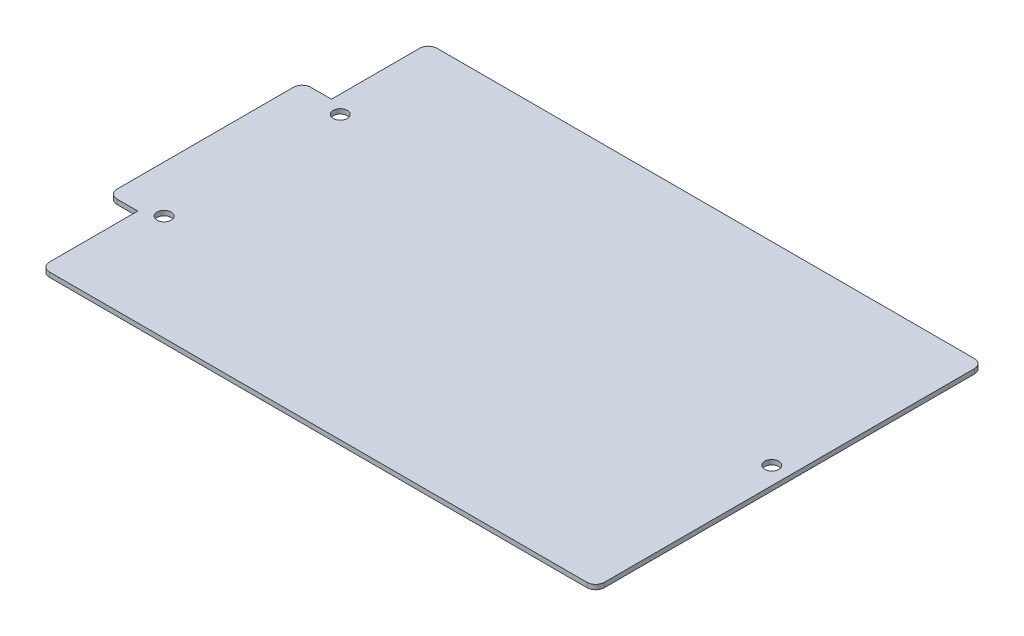
ISO-10303-21;
HEADER;
FILE_DESCRIPTION(('STEP AP214'),'2;1');
FILE_NAME('part.step','',(''),(''),'','','');
FILE_SCHEMA(('AUTOMOTIVE_DESIGN { 1 0 10303 214 1 1 1 1 }'));
ENDSEC;
DATA;
#1=APPLICATION_CONTEXT('core data for automotive mechanical design processes');
#2=APPLICATION_PROTOCOL_DEFINITION('international standard','automotive_design',2000,#1);
#3=PRODUCT_CONTEXT('',#1,'mechanical');
#4=PRODUCT('Part','Part','',(#3));
#5=PRODUCT_RELATED_PRODUCT_CATEGORY('part','',(#4));
#6=PRODUCT_DEFINITION_FORMATION('','',#4);
#7=PRODUCT_DEFINITION_CONTEXT('part definition',#1,'design');
#8=PRODUCT_DEFINITION('design','',#6,#7);
#9=PRODUCT_DEFINITION_SHAPE('','',#8);
#10=(LENGTH_UNIT() NAMED_UNIT(*) SI_UNIT(.MILLI.,.METRE.));
#11=(NAMED_UNIT(*) PLANE_ANGLE_UNIT() SI_UNIT($,.RADIAN.));
#12=(NAMED_UNIT(*) SI_UNIT($,.STERADIAN.) SOLID_ANGLE_UNIT());
#13=UNCERTAINTY_MEASURE_WITH_UNIT(LENGTH_MEASURE(1.E-05),#10,'distance_accuracy_value','');
#14=(GEOMETRIC_REPRESENTATION_CONTEXT(3) GLOBAL_UNCERTAINTY_ASSIGNED_CONTEXT((#13)) GLOBAL_UNIT_ASSIGNED_CONTEXT((#10,
#11,#12)) REPRESENTATION_CONTEXT('',''));
#15=CARTESIAN_POINT('',(0.,0.,0.));
#16=DIRECTION('',(0.,0.,1.));
#17=DIRECTION('',(1.,0.,0.));
#18=AXIS2_PLACEMENT_3D('',#15,#16,#17);
#19=CARTESIAN_POINT('',(0.,1.6,0.));
#20=DIRECTION('',(0.,1.,0.));
#21=DIRECTION('',(0.,0.,1.));
#22=AXIS2_PLACEMENT_3D('',#19,#20,#21);
#23=PLANE('',#22);
#24=CARTESIAN_POINT('',(183.,1.6,-66.));
#25=DIRECTION('',(0.,1.,0.));
#26=DIRECTION('',(0.,0.,1.));
#27=AXIS2_PLACEMENT_3D('',#24,#25,#26);
#28=CIRCLE('',#27,2.4);
#29=CARTESIAN_POINT('',(183.,1.6,-63.6));
#30=VERTEX_POINT('',#29);
#31=EDGE_CURVE('E172',#30,#30,#28,.T.);
#32=ORIENTED_EDGE('',*,*,#31,.F.);
#33=EDGE_LOOP('',(#32));
#34=FACE_BOUND('',#33,.T.);
#35=CARTESIAN_POINT('',(6.00000000000001,1.6,-96.));
#36=DIRECTION('',(0.,1.,0.));
#37=DIRECTION('',(0.,0.,1.));
#38=AXIS2_PLACEMENT_3D('',#35,#36,#37);
#39=CIRCLE('',#38,2.4);
#40=CARTESIAN_POINT('',(6.00000000000001,1.6,-93.6));
#41=VERTEX_POINT('',#40);
#42=EDGE_CURVE('E184',#41,#41,#39,.T.);
#43=ORIENTED_EDGE('',*,*,#42,.F.);
#44=EDGE_LOOP('',(#43));
#45=FACE_BOUND('',#44,.T.);
#46=CARTESIAN_POINT('',(6.00000000000001,1.6,-36.));
#47=DIRECTION('',(0.,1.,0.));
#48=DIRECTION('',(0.,0.,1.));
#49=AXIS2_PLACEMENT_3D('',#46,#47,#48);
#50=CIRCLE('',#49,2.4);
#51=CARTESIAN_POINT('',(6.00000000000001,1.6,-33.6));
#52=VERTEX_POINT('',#51);
#53=EDGE_CURVE('E178',#52,#52,#50,.T.);
#54=ORIENTED_EDGE('',*,*,#53,.F.);
#55=EDGE_LOOP('',(#54));
#56=FACE_BOUND('',#55,.T.);
#57=DIRECTION('',(0.,0.,1.));
#58=VECTOR('',#57,1.);
#59=CARTESIAN_POINT('',(-9.99999999999998,1.6,-132.));
#60=LINE('',#59,#58);
#61=CARTESIAN_POINT('',(-9.99999999999998,1.6,-96.));
#62=VERTEX_POINT('',#61);
#63=CARTESIAN_POINT('',(-9.99999999999998,1.6,-36.));
#64=VERTEX_POINT('',#63);
#65=EDGE_CURVE('E193',#62,#64,#60,.T.);
#66=ORIENTED_EDGE('',*,*,#65,.T.);
#67=CARTESIAN_POINT('',(-6.99999999999998,1.6,-36.));
#68=DIRECTION('',(0.,1.,0.));
#69=DIRECTION('',(0.,0.,1.));
#70=AXIS2_PLACEMENT_3D('',#67,#68,#69);
#71=CIRCLE('',#70,3.);
#72=CARTESIAN_POINT('',(-6.99999999999998,1.6,-33.));
#73=VERTEX_POINT('',#72);
#74=EDGE_CURVE('E227',#64,#73,#71,.T.);
#75=ORIENTED_EDGE('',*,*,#74,.T.);
#76=DIRECTION('',(1.,0.,0.));
#77=VECTOR('',#76,1.);
#78=CARTESIAN_POINT('',(-9.99999999999998,1.6,-33.));
#79=LINE('',#78,#77);
#80=CARTESIAN_POINT('',(0.,1.6,-33.));
#81=VERTEX_POINT('',#80);
#82=EDGE_CURVE('E154',#73,#81,#79,.T.);
#83=ORIENTED_EDGE('',*,*,#82,.T.);
#84=DIRECTION('',(0.,0.,1.));
#85=VECTOR('',#84,1.);
#86=CARTESIAN_POINT('',(0.,1.6,0.));
#87=LINE('',#86,#85);
#88=CARTESIAN_POINT('',(0.,1.6,-3.));
#89=VERTEX_POINT('',#88);
#90=EDGE_CURVE('E149',#81,#89,#87,.T.);
#91=ORIENTED_EDGE('',*,*,#90,.T.);
#92=CARTESIAN_POINT('',(3.00000000000002,1.6,-3.));
#93=DIRECTION('',(0.,1.,0.));
#94=DIRECTION('',(0.,0.,1.));
#95=AXIS2_PLACEMENT_3D('',#92,#93,#94);
#96=CIRCLE('',#95,3.);
#97=CARTESIAN_POINT('',(3.00000000000002,1.6,0.));
#98=VERTEX_POINT('',#97);
#99=EDGE_CURVE('E225',#89,#98,#96,.T.);
#100=ORIENTED_EDGE('',*,*,#99,.T.);
#101=DIRECTION('',(1.,0.,0.));
#102=VECTOR('',#101,1.);
#103=CARTESIAN_POINT('',(-9.99999999999998,1.6,0.));
#104=LINE('',#103,#102);
#105=CARTESIAN_POINT('',(186.,1.6,0.));
#106=VERTEX_POINT('',#105);
#107=EDGE_CURVE('E197',#98,#106,#104,.T.);
#108=ORIENTED_EDGE('',*,*,#107,.T.);
#109=CARTESIAN_POINT('',(186.,1.6,-3.));
#110=DIRECTION('',(0.,1.,0.));
#111=DIRECTION('',(0.,0.,1.));
#112=AXIS2_PLACEMENT_3D('',#109,#110,#111);
#113=CIRCLE('',#112,3.);
#114=CARTESIAN_POINT('',(189.,1.6,-3.));
#115=VERTEX_POINT('',#114);
#116=EDGE_CURVE('E223',#106,#115,#113,.T.);
#117=ORIENTED_EDGE('',*,*,#116,.T.);
#118=DIRECTION('',(0.,0.,-1.));
#119=VECTOR('',#118,1.);
#120=CARTESIAN_POINT('',(189.,1.6,-132.));
#121=LINE('',#120,#119);
#122=CARTESIAN_POINT('',(189.,1.6,-129.));
#123=VERTEX_POINT('',#122);
#124=EDGE_CURVE('E200',#115,#123,#121,.T.);
#125=ORIENTED_EDGE('',*,*,#124,.T.);
#126=CARTESIAN_POINT('',(186.,1.6,-129.));
#127=DIRECTION('',(0.,1.,0.));
#128=DIRECTION('',(0.,0.,1.));
#129=AXIS2_PLACEMENT_3D('',#126,#127,#128);
#130=CIRCLE('',#129,3.);
#131=CARTESIAN_POINT('',(186.,1.6,-132.));
#132=VERTEX_POINT('',#131);
#133=EDGE_CURVE('E221',#123,#132,#130,.T.);
#134=ORIENTED_EDGE('',*,*,#133,.T.);
#135=DIRECTION('',(-1.,0.,0.));
#136=VECTOR('',#135,1.);
#137=CARTESIAN_POINT('',(0.,1.6,-132.));
#138=LINE('',#137,#136);
#139=CARTESIAN_POINT('',(3.00000000000002,1.6,-132.));
#140=VERTEX_POINT('',#139);
#141=EDGE_CURVE('E190',#132,#140,#138,.T.);
#142=ORIENTED_EDGE('',*,*,#141,.T.);
#143=CARTESIAN_POINT('',(3.00000000000002,1.6,-129.));
#144=DIRECTION('',(0.,1.,0.));
#145=DIRECTION('',(0.,0.,1.));
#146=AXIS2_PLACEMENT_3D('',#143,#144,#145);
#147=CIRCLE('',#146,3.);
#148=CARTESIAN_POINT('',(0.,1.6,-129.));
#149=VERTEX_POINT('',#148);
#150=EDGE_CURVE('E219',#140,#149,#147,.T.);
#151=ORIENTED_EDGE('',*,*,#150,.T.);
#152=DIRECTION('',(0.,0.,-1.));
#153=VECTOR('',#152,1.);
#154=CARTESIAN_POINT('',(0.,1.6,-132.));
#155=LINE('',#154,#153);
#156=CARTESIAN_POINT('',(0.,1.6,-99.));
#157=VERTEX_POINT('',#156);
#158=EDGE_CURVE('E162',#157,#149,#155,.T.);
#159=ORIENTED_EDGE('',*,*,#158,.F.);
#160=DIRECTION('',(1.,0.,0.));
#161=VECTOR('',#160,1.);
#162=CARTESIAN_POINT('',(-9.99999999999998,1.6,-99.));
#163=LINE('',#162,#161);
#164=CARTESIAN_POINT('',(-6.99999999999998,1.6,-99.));
#165=VERTEX_POINT('',#164);
#166=EDGE_CURVE('E156',#165,#157,#163,.T.);
#167=ORIENTED_EDGE('',*,*,#166,.F.);
#168=CARTESIAN_POINT('',(-6.99999999999998,1.6,-96.));
#169=DIRECTION('',(0.,1.,0.));
#170=DIRECTION('',(0.,0.,1.));
#171=AXIS2_PLACEMENT_3D('',#168,#169,#170);
#172=CIRCLE('',#171,3.);
#173=EDGE_CURVE('E217',#165,#62,#172,.T.);
#174=ORIENTED_EDGE('',*,*,#173,.T.);
#175=EDGE_LOOP('',(#66,#75,#83,#91,#100,#108,#117,#125,#134,#142,#151,#159,#167,#174));
#176=FACE_BOUND('',#175,.T.);
#177=ADVANCED_FACE('F32',(#34,#45,#56,#176),#23,.T.);
#178=CARTESIAN_POINT('',(0.,0.,0.));
#179=DIRECTION('',(0.,1.,0.));
#180=DIRECTION('',(0.,0.,1.));
#181=AXIS2_PLACEMENT_3D('',#178,#179,#180);
#182=PLANE('',#181);
#183=CARTESIAN_POINT('',(183.,0.,-66.));
#184=DIRECTION('',(0.,1.,0.));
#185=DIRECTION('',(0.,0.,1.));
#186=AXIS2_PLACEMENT_3D('',#183,#184,#185);
#187=CIRCLE('',#186,2.4);
#188=CARTESIAN_POINT('',(183.,0.,-63.6));
#189=VERTEX_POINT('',#188);
#190=EDGE_CURVE('E171',#189,#189,#187,.T.);
#191=ORIENTED_EDGE('',*,*,#190,.T.);
#192=EDGE_LOOP('',(#191));
#193=FACE_BOUND('',#192,.T.);
#194=CARTESIAN_POINT('',(6.00000000000001,0.,-96.));
#195=DIRECTION('',(0.,1.,0.));
#196=DIRECTION('',(0.,0.,1.));
#197=AXIS2_PLACEMENT_3D('',#194,#195,#196);
#198=CIRCLE('',#197,2.4);
#199=CARTESIAN_POINT('',(6.00000000000001,0.,-93.6));
#200=VERTEX_POINT('',#199);
#201=EDGE_CURVE('E181',#200,#200,#198,.T.);
#202=ORIENTED_EDGE('',*,*,#201,.T.);
#203=EDGE_LOOP('',(#202));
#204=FACE_BOUND('',#203,.T.);
#205=CARTESIAN_POINT('',(6.00000000000001,0.,-36.));
#206=DIRECTION('',(0.,1.,0.));
#207=DIRECTION('',(0.,0.,1.));
#208=AXIS2_PLACEMENT_3D('',#205,#206,#207);
#209=CIRCLE('',#208,2.4);
#210=CARTESIAN_POINT('',(6.00000000000001,0.,-33.6));
#211=VERTEX_POINT('',#210);
#212=EDGE_CURVE('E175',#211,#211,#209,.T.);
#213=ORIENTED_EDGE('',*,*,#212,.T.);
#214=EDGE_LOOP('',(#213));
#215=FACE_BOUND('',#214,.T.);
#216=DIRECTION('',(-1.,0.,0.));
#217=VECTOR('',#216,1.);
#218=CARTESIAN_POINT('',(-9.99999999999998,0.,-33.));
#219=LINE('',#218,#217);
#220=CARTESIAN_POINT('',(0.,0.,-33.));
#221=VERTEX_POINT('',#220);
#222=CARTESIAN_POINT('',(-6.99999999999998,0.,-33.));
#223=VERTEX_POINT('',#222);
#224=EDGE_CURVE('E134',#221,#223,#219,.T.);
#225=ORIENTED_EDGE('',*,*,#224,.T.);
#226=CARTESIAN_POINT('',(-6.99999999999998,0.,-36.));
#227=DIRECTION('',(0.,1.,0.));
#228=DIRECTION('',(0.,0.,1.));
#229=AXIS2_PLACEMENT_3D('',#226,#227,#228);
#230=CIRCLE('',#229,3.);
#231=CARTESIAN_POINT('',(-9.99999999999998,0.,-36.));
#232=VERTEX_POINT('',#231);
#233=EDGE_CURVE('E238',#223,#232,#230,.F.);
#234=ORIENTED_EDGE('',*,*,#233,.T.);
#235=DIRECTION('',(0.,0.,1.));
#236=VECTOR('',#235,1.);
#237=CARTESIAN_POINT('',(-9.99999999999998,0.,-132.));
#238=LINE('',#237,#236);
#239=CARTESIAN_POINT('',(-9.99999999999998,0.,-96.));
#240=VERTEX_POINT('',#239);
#241=EDGE_CURVE('E187',#240,#232,#238,.T.);
#242=ORIENTED_EDGE('',*,*,#241,.F.);
#243=CARTESIAN_POINT('',(-6.99999999999998,0.,-96.));
#244=DIRECTION('',(0.,1.,0.));
#245=DIRECTION('',(0.,0.,1.));
#246=AXIS2_PLACEMENT_3D('',#243,#244,#245);
#247=CIRCLE('',#246,3.);
#248=CARTESIAN_POINT('',(-6.99999999999998,0.,-99.));
#249=VERTEX_POINT('',#248);
#250=EDGE_CURVE('E230',#240,#249,#247,.F.);
#251=ORIENTED_EDGE('',*,*,#250,.T.);
#252=DIRECTION('',(-1.,0.,0.));
#253=VECTOR('',#252,1.);
#254=CARTESIAN_POINT('',(-9.99999999999998,0.,-99.));
#255=LINE('',#254,#253);
#256=CARTESIAN_POINT('',(0.,0.,-99.));
#257=VERTEX_POINT('',#256);
#258=EDGE_CURVE('E168',#257,#249,#255,.T.);
#259=ORIENTED_EDGE('',*,*,#258,.F.);
#260=DIRECTION('',(0.,0.,1.));
#261=VECTOR('',#260,1.);
#262=CARTESIAN_POINT('',(0.,0.,-132.));
#263=LINE('',#262,#261);
#264=CARTESIAN_POINT('',(0.,0.,-129.));
#265=VERTEX_POINT('',#264);
#266=EDGE_CURVE('E153',#265,#257,#263,.T.);
#267=ORIENTED_EDGE('',*,*,#266,.F.);
#268=CARTESIAN_POINT('',(3.00000000000002,0.,-129.));
#269=DIRECTION('',(0.,1.,0.));
#270=DIRECTION('',(0.,0.,1.));
#271=AXIS2_PLACEMENT_3D('',#268,#269,#270);
#272=CIRCLE('',#271,3.);
#273=CARTESIAN_POINT('',(3.00000000000002,0.,-132.));
#274=VERTEX_POINT('',#273);
#275=EDGE_CURVE('E232',#265,#274,#272,.F.);
#276=ORIENTED_EDGE('',*,*,#275,.T.);
#277=DIRECTION('',(-1.,0.,0.));
#278=VECTOR('',#277,1.);
#279=CARTESIAN_POINT('',(0.,0.,-132.));
#280=LINE('',#279,#278);
#281=CARTESIAN_POINT('',(186.,0.,-132.));
#282=VERTEX_POINT('',#281);
#283=EDGE_CURVE('E194',#282,#274,#280,.T.);
#284=ORIENTED_EDGE('',*,*,#283,.F.);
#285=CARTESIAN_POINT('',(186.,0.,-129.));
#286=DIRECTION('',(0.,1.,0.));
#287=DIRECTION('',(0.,0.,1.));
#288=AXIS2_PLACEMENT_3D('',#285,#286,#287);
#289=CIRCLE('',#288,3.);
#290=CARTESIAN_POINT('',(189.,0.,-129.));
#291=VERTEX_POINT('',#290);
#292=EDGE_CURVE('E234',#282,#291,#289,.F.);
#293=ORIENTED_EDGE('',*,*,#292,.T.);
#294=DIRECTION('',(0.,0.,-1.));
#295=VECTOR('',#294,1.);
#296=CARTESIAN_POINT('',(189.,0.,-132.));
#297=LINE('',#296,#295);
#298=CARTESIAN_POINT('',(189.,0.,-3.));
#299=VERTEX_POINT('',#298);
#300=EDGE_CURVE('E208',#299,#291,#297,.T.);
#301=ORIENTED_EDGE('',*,*,#300,.F.);
#302=CARTESIAN_POINT('',(186.,0.,-3.));
#303=DIRECTION('',(0.,1.,0.));
#304=DIRECTION('',(0.,0.,1.));
#305=AXIS2_PLACEMENT_3D('',#302,#303,#304);
#306=CIRCLE('',#305,3.);
#307=CARTESIAN_POINT('',(186.,0.,0.));
#308=VERTEX_POINT('',#307);
#309=EDGE_CURVE('E53',#299,#308,#306,.F.);
#310=ORIENTED_EDGE('',*,*,#309,.T.);
#311=DIRECTION('',(1.,0.,0.));
#312=VECTOR('',#311,1.);
#313=CARTESIAN_POINT('',(0.,0.,0.));
#314=LINE('',#313,#312);
#315=CARTESIAN_POINT('',(3.00000000000002,0.,0.));
#316=VERTEX_POINT('',#315);
#317=EDGE_CURVE('E206',#316,#308,#314,.T.);
#318=ORIENTED_EDGE('',*,*,#317,.F.);
#319=CARTESIAN_POINT('',(3.00000000000002,0.,-3.));
#320=DIRECTION('',(0.,1.,0.));
#321=DIRECTION('',(0.,0.,1.));
#322=AXIS2_PLACEMENT_3D('',#319,#320,#321);
#323=CIRCLE('',#322,3.);
#324=CARTESIAN_POINT('',(0.,0.,-3.));
#325=VERTEX_POINT('',#324);
#326=EDGE_CURVE('E47',#316,#325,#323,.F.);
#327=ORIENTED_EDGE('',*,*,#326,.T.);
#328=DIRECTION('',(0.,0.,-1.));
#329=VECTOR('',#328,1.);
#330=CARTESIAN_POINT('',(0.,0.,0.));
#331=LINE('',#330,#329);
#332=EDGE_CURVE('E131',#325,#221,#331,.T.);
#333=ORIENTED_EDGE('',*,*,#332,.T.);
#334=EDGE_LOOP('',(#225,#234,#242,#251,#259,#267,#276,#284,#293,#301,#310,#318,#327,#333));
#335=FACE_BOUND('',#334,.T.);
#336=ADVANCED_FACE('F133',(#193,#204,#215,#335),#182,.F.);
#337=CARTESIAN_POINT('',(-9.99999999999998,1.6,-132.));
#338=DIRECTION('',(1.,0.,0.));
#339=DIRECTION('',(0.,0.,-1.));
#340=AXIS2_PLACEMENT_3D('',#337,#338,#339);
#341=PLANE('',#340);
#342=ORIENTED_EDGE('',*,*,#241,.T.);
#343=DIRECTION('',(0.,1.,0.));
#344=VECTOR('',#343,1.);
#345=CARTESIAN_POINT('',(-9.99999999999998,1.6,-36.));
#346=LINE('',#345,#344);
#347=EDGE_CURVE('E214',#232,#64,#346,.T.);
#348=ORIENTED_EDGE('',*,*,#347,.T.);
#349=ORIENTED_EDGE('',*,*,#65,.F.);
#350=DIRECTION('',(0.,1.,0.));
#351=VECTOR('',#350,1.);
#352=CARTESIAN_POINT('',(-9.99999999999998,1.6,-96.));
#353=LINE('',#352,#351);
#354=EDGE_CURVE('E203',#62,#240,#353,.F.);
#355=ORIENTED_EDGE('',*,*,#354,.T.);
#356=EDGE_LOOP('',(#342,#348,#349,#355));
#357=FACE_BOUND('',#356,.T.);
#358=ADVANCED_FACE('F307',(#357),#341,.F.);
#359=CARTESIAN_POINT('',(0.,1.6,0.));
#360=DIRECTION('',(0.,0.,-1.));
#361=DIRECTION('',(-1.,0.,0.));
#362=AXIS2_PLACEMENT_3D('',#359,#360,#361);
#363=PLANE('',#362);
#364=ORIENTED_EDGE('',*,*,#107,.F.);
#365=DIRECTION('',(0.,1.,0.));
#366=VECTOR('',#365,1.);
#367=CARTESIAN_POINT('',(3.00000000000002,0.,0.));
#368=LINE('',#367,#366);
#369=EDGE_CURVE('E244',#98,#316,#368,.F.);
#370=ORIENTED_EDGE('',*,*,#369,.T.);
#371=ORIENTED_EDGE('',*,*,#317,.T.);
#372=DIRECTION('',(0.,-1.,0.));
#373=VECTOR('',#372,1.);
#374=CARTESIAN_POINT('',(186.,1.6,0.));
#375=LINE('',#374,#373);
#376=EDGE_CURVE('E242',#308,#106,#375,.F.);
#377=ORIENTED_EDGE('',*,*,#376,.T.);
#378=EDGE_LOOP('',(#364,#370,#371,#377));
#379=FACE_BOUND('',#378,.T.);
#380=ADVANCED_FACE('F287',(#379),#363,.F.);
#381=CARTESIAN_POINT('',(189.,1.6,-132.));
#382=DIRECTION('',(-1.,0.,0.));
#383=DIRECTION('',(0.,0.,1.));
#384=AXIS2_PLACEMENT_3D('',#381,#382,#383);
#385=PLANE('',#384);
#386=ORIENTED_EDGE('',*,*,#124,.F.);
#387=DIRECTION('',(0.,-1.,0.));
#388=VECTOR('',#387,1.);
#389=CARTESIAN_POINT('',(189.,1.6,-3.));
#390=LINE('',#389,#388);
#391=EDGE_CURVE('E248',#115,#299,#390,.T.);
#392=ORIENTED_EDGE('',*,*,#391,.T.);
#393=ORIENTED_EDGE('',*,*,#300,.T.);
#394=DIRECTION('',(0.,-1.,0.));
#395=VECTOR('',#394,1.);
#396=CARTESIAN_POINT('',(189.,1.6,-129.));
#397=LINE('',#396,#395);
#398=EDGE_CURVE('E246',#291,#123,#397,.F.);
#399=ORIENTED_EDGE('',*,*,#398,.T.);
#400=EDGE_LOOP('',(#386,#392,#393,#399));
#401=FACE_BOUND('',#400,.T.);
#402=ADVANCED_FACE('F279',(#401),#385,.F.);
#403=CARTESIAN_POINT('',(0.,1.6,-132.));
#404=DIRECTION('',(0.,0.,1.));
#405=DIRECTION('',(1.,0.,0.));
#406=AXIS2_PLACEMENT_3D('',#403,#404,#405);
#407=PLANE('',#406);
#408=ORIENTED_EDGE('',*,*,#141,.F.);
#409=DIRECTION('',(0.,-1.,0.));
#410=VECTOR('',#409,1.);
#411=CARTESIAN_POINT('',(186.,1.6,-132.));
#412=LINE('',#411,#410);
#413=EDGE_CURVE('E254',#132,#282,#412,.T.);
#414=ORIENTED_EDGE('',*,*,#413,.T.);
#415=ORIENTED_EDGE('',*,*,#283,.T.);
#416=DIRECTION('',(0.,1.,0.));
#417=VECTOR('',#416,1.);
#418=CARTESIAN_POINT('',(3.00000000000002,1.6,-132.));
#419=LINE('',#418,#417);
#420=EDGE_CURVE('E251',#274,#140,#419,.T.);
#421=ORIENTED_EDGE('',*,*,#420,.T.);
#422=EDGE_LOOP('',(#408,#414,#415,#421));
#423=FACE_BOUND('',#422,.T.);
#424=ADVANCED_FACE('F270',(#423),#407,.F.);
#425=CARTESIAN_POINT('',(6.00000000000001,1.6,-96.));
#426=DIRECTION('',(0.,-1.,0.));
#427=DIRECTION('',(0.,0.,-1.));
#428=AXIS2_PLACEMENT_3D('',#425,#426,#427);
#429=CYLINDRICAL_SURFACE('',#428,2.4);
#430=ORIENTED_EDGE('',*,*,#42,.T.);
#431=EDGE_LOOP('',(#430));
#432=FACE_BOUND('',#431,.T.);
#433=ORIENTED_EDGE('',*,*,#201,.F.);
#434=EDGE_LOOP('',(#433));
#435=FACE_BOUND('',#434,.T.);
#436=ADVANCED_FACE('F313',(#432,#435),#429,.F.);
#437=CARTESIAN_POINT('',(6.00000000000001,1.6,-36.));
#438=DIRECTION('',(0.,-1.,0.));
#439=DIRECTION('',(0.,0.,-1.));
#440=AXIS2_PLACEMENT_3D('',#437,#438,#439);
#441=CYLINDRICAL_SURFACE('',#440,2.4);
#442=ORIENTED_EDGE('',*,*,#53,.T.);
#443=EDGE_LOOP('',(#442));
#444=FACE_BOUND('',#443,.T.);
#445=ORIENTED_EDGE('',*,*,#212,.F.);
#446=EDGE_LOOP('',(#445));
#447=FACE_BOUND('',#446,.T.);
#448=ADVANCED_FACE('F348',(#444,#447),#441,.F.);
#449=CARTESIAN_POINT('',(183.,1.6,-66.));
#450=DIRECTION('',(0.,-1.,0.));
#451=DIRECTION('',(0.,0.,-1.));
#452=AXIS2_PLACEMENT_3D('',#449,#450,#451);
#453=CYLINDRICAL_SURFACE('',#452,2.4);
#454=ORIENTED_EDGE('',*,*,#31,.T.);
#455=EDGE_LOOP('',(#454));
#456=FACE_BOUND('',#455,.T.);
#457=ORIENTED_EDGE('',*,*,#190,.F.);
#458=EDGE_LOOP('',(#457));
#459=FACE_BOUND('',#458,.T.);
#460=ADVANCED_FACE('F343',(#456,#459),#453,.F.);
#461=CARTESIAN_POINT('',(0.,-0.000999999999999916,-132.));
#462=DIRECTION('',(1.,0.,0.));
#463=DIRECTION('',(0.,0.,-1.));
#464=AXIS2_PLACEMENT_3D('',#461,#462,#463);
#465=PLANE('',#464);
#466=ORIENTED_EDGE('',*,*,#158,.T.);
#467=DIRECTION('',(0.,1.,0.));
#468=VECTOR('',#467,1.);
#469=CARTESIAN_POINT('',(0.,-0.000999999999999916,-129.));
#470=LINE('',#469,#468);
#471=EDGE_CURVE('E40',#149,#265,#470,.F.);
#472=ORIENTED_EDGE('',*,*,#471,.T.);
#473=ORIENTED_EDGE('',*,*,#266,.T.);
#474=DIRECTION('',(0.,1.,0.));
#475=VECTOR('',#474,1.);
#476=CARTESIAN_POINT('',(0.,-0.000999999999999916,-99.));
#477=LINE('',#476,#475);
#478=EDGE_CURVE('E165',#257,#157,#477,.T.);
#479=ORIENTED_EDGE('',*,*,#478,.T.);
#480=EDGE_LOOP('',(#466,#472,#473,#479));
#481=FACE_BOUND('',#480,.T.);
#482=ADVANCED_FACE('F259',(#481),#465,.F.);
#483=CARTESIAN_POINT('',(-9.99999999999998,-0.000999999999999916,-99.));
#484=DIRECTION('',(0.,0.,1.));
#485=DIRECTION('',(1.,0.,0.));
#486=AXIS2_PLACEMENT_3D('',#483,#484,#485);
#487=PLANE('',#486);
#488=ORIENTED_EDGE('',*,*,#258,.T.);
#489=DIRECTION('',(0.,1.,0.));
#490=VECTOR('',#489,1.);
#491=CARTESIAN_POINT('',(-6.99999999999998,-0.000999999999999916,-99.));
#492=LINE('',#491,#490);
#493=EDGE_CURVE('E11',#249,#165,#492,.T.);
#494=ORIENTED_EDGE('',*,*,#493,.T.);
#495=ORIENTED_EDGE('',*,*,#166,.T.);
#496=ORIENTED_EDGE('',*,*,#478,.F.);
#497=EDGE_LOOP('',(#488,#494,#495,#496));
#498=FACE_BOUND('',#497,.T.);
#499=ADVANCED_FACE('F335',(#498),#487,.F.);
#500=CARTESIAN_POINT('',(-9.99999999999998,-0.000999999999999916,-33.));
#501=DIRECTION('',(0.,0.,1.));
#502=DIRECTION('',(1.,0.,0.));
#503=AXIS2_PLACEMENT_3D('',#500,#501,#502);
#504=PLANE('',#503);
#505=ORIENTED_EDGE('',*,*,#82,.F.);
#506=DIRECTION('',(0.,1.,0.));
#507=VECTOR('',#506,1.);
#508=CARTESIAN_POINT('',(-6.99999999999998,0.,-33.));
#509=LINE('',#508,#507);
#510=EDGE_CURVE('E148',#73,#223,#509,.F.);
#511=ORIENTED_EDGE('',*,*,#510,.T.);
#512=ORIENTED_EDGE('',*,*,#224,.F.);
#513=DIRECTION('',(0.,1.,0.));
#514=VECTOR('',#513,1.);
#515=CARTESIAN_POINT('',(0.,-0.000999999999999916,-33.));
#516=LINE('',#515,#514);
#517=EDGE_CURVE('E145',#221,#81,#516,.T.);
#518=ORIENTED_EDGE('',*,*,#517,.T.);
#519=EDGE_LOOP('',(#505,#511,#512,#518));
#520=FACE_BOUND('',#519,.T.);
#521=ADVANCED_FACE('F144',(#520),#504,.T.);
#522=CARTESIAN_POINT('',(0.,-0.000999999999999916,0.));
#523=DIRECTION('',(-1.,0.,0.));
#524=DIRECTION('',(0.,0.,1.));
#525=AXIS2_PLACEMENT_3D('',#522,#523,#524);
#526=PLANE('',#525);
#527=ORIENTED_EDGE('',*,*,#332,.F.);
#528=DIRECTION('',(0.,1.,0.));
#529=VECTOR('',#528,1.);
#530=CARTESIAN_POINT('',(0.,1.6,-3.));
#531=LINE('',#530,#529);
#532=EDGE_CURVE('E240',#325,#89,#531,.T.);
#533=ORIENTED_EDGE('',*,*,#532,.T.);
#534=ORIENTED_EDGE('',*,*,#90,.F.);
#535=ORIENTED_EDGE('',*,*,#517,.F.);
#536=EDGE_LOOP('',(#527,#533,#534,#535));
#537=FACE_BOUND('',#536,.T.);
#538=ADVANCED_FACE('F151',(#537),#526,.T.);
#539=CARTESIAN_POINT('',(-6.99999999999998,1.6,-36.));
#540=DIRECTION('',(0.,-1.,0.));
#541=DIRECTION('',(0.,0.,-1.));
#542=AXIS2_PLACEMENT_3D('',#539,#540,#541);
#543=CYLINDRICAL_SURFACE('',#542,3.);
#544=ORIENTED_EDGE('',*,*,#233,.F.);
#545=ORIENTED_EDGE('',*,*,#510,.F.);
#546=ORIENTED_EDGE('',*,*,#74,.F.);
#547=ORIENTED_EDGE('',*,*,#347,.F.);
#548=EDGE_LOOP('',(#544,#545,#546,#547));
#549=FACE_BOUND('',#548,.T.);
#550=ADVANCED_FACE('F292',(#549),#543,.T.);
#551=CARTESIAN_POINT('',(3.00000000000002,-0.000999999999999916,-3.));
#552=DIRECTION('',(0.,-1.,0.));
#553=DIRECTION('',(0.,0.,-1.));
#554=AXIS2_PLACEMENT_3D('',#551,#552,#553);
#555=CYLINDRICAL_SURFACE('',#554,3.);
#556=ORIENTED_EDGE('',*,*,#326,.F.);
#557=ORIENTED_EDGE('',*,*,#369,.F.);
#558=ORIENTED_EDGE('',*,*,#99,.F.);
#559=ORIENTED_EDGE('',*,*,#532,.F.);
#560=EDGE_LOOP('',(#556,#557,#558,#559));
#561=FACE_BOUND('',#560,.T.);
#562=ADVANCED_FACE('F290',(#561),#555,.T.);
#563=CARTESIAN_POINT('',(186.,1.6,-3.));
#564=DIRECTION('',(0.,-1.,0.));
#565=DIRECTION('',(0.,0.,-1.));
#566=AXIS2_PLACEMENT_3D('',#563,#564,#565);
#567=CYLINDRICAL_SURFACE('',#566,3.);
#568=ORIENTED_EDGE('',*,*,#116,.F.);
#569=ORIENTED_EDGE('',*,*,#376,.F.);
#570=ORIENTED_EDGE('',*,*,#309,.F.);
#571=ORIENTED_EDGE('',*,*,#391,.F.);
#572=EDGE_LOOP('',(#568,#569,#570,#571));
#573=FACE_BOUND('',#572,.T.);
#574=ADVANCED_FACE('F283',(#573),#567,.T.);
#575=CARTESIAN_POINT('',(186.,1.6,-129.));
#576=DIRECTION('',(0.,-1.,0.));
#577=DIRECTION('',(0.,0.,-1.));
#578=AXIS2_PLACEMENT_3D('',#575,#576,#577);
#579=CYLINDRICAL_SURFACE('',#578,3.);
#580=ORIENTED_EDGE('',*,*,#133,.F.);
#581=ORIENTED_EDGE('',*,*,#398,.F.);
#582=ORIENTED_EDGE('',*,*,#292,.F.);
#583=ORIENTED_EDGE('',*,*,#413,.F.);
#584=EDGE_LOOP('',(#580,#581,#582,#583));
#585=FACE_BOUND('',#584,.T.);
#586=ADVANCED_FACE('F277',(#585),#579,.T.);
#587=CARTESIAN_POINT('',(3.00000000000002,1.6,-129.));
#588=DIRECTION('',(0.,1.,0.));
#589=DIRECTION('',(0.,0.,1.));
#590=AXIS2_PLACEMENT_3D('',#587,#588,#589);
#591=CYLINDRICAL_SURFACE('',#590,3.);
#592=ORIENTED_EDGE('',*,*,#275,.F.);
#593=ORIENTED_EDGE('',*,*,#471,.F.);
#594=ORIENTED_EDGE('',*,*,#150,.F.);
#595=ORIENTED_EDGE('',*,*,#420,.F.);
#596=EDGE_LOOP('',(#592,#593,#594,#595));
#597=FACE_BOUND('',#596,.T.);
#598=ADVANCED_FACE('F267',(#597),#591,.T.);
#599=CARTESIAN_POINT('',(-6.99999999999998,-0.000999999999999916,-96.));
#600=DIRECTION('',(0.,1.,0.));
#601=DIRECTION('',(0.,0.,1.));
#602=AXIS2_PLACEMENT_3D('',#599,#600,#601);
#603=CYLINDRICAL_SURFACE('',#602,3.);
#604=ORIENTED_EDGE('',*,*,#250,.F.);
#605=ORIENTED_EDGE('',*,*,#354,.F.);
#606=ORIENTED_EDGE('',*,*,#173,.F.);
#607=ORIENTED_EDGE('',*,*,#493,.F.);
#608=EDGE_LOOP('',(#604,#605,#606,#607));
#609=FACE_BOUND('',#608,.T.);
#610=ADVANCED_FACE('F34',(#609),#603,.T.);
#611=CLOSED_SHELL('',(#177,#336,#358,#380,#402,#424,#436,#448,#460,#482,#499,#521,#538,#550,
#562,#574,#586,#598,#610));
#612=MANIFOLD_SOLID_BREP('B2',#611);
#613=ADVANCED_BREP_SHAPE_REPRESENTATION('',(#18,#612),#14);
#614=SHAPE_DEFINITION_REPRESENTATION(#9,#613);
ENDSEC;
END-ISO-10303-21;
